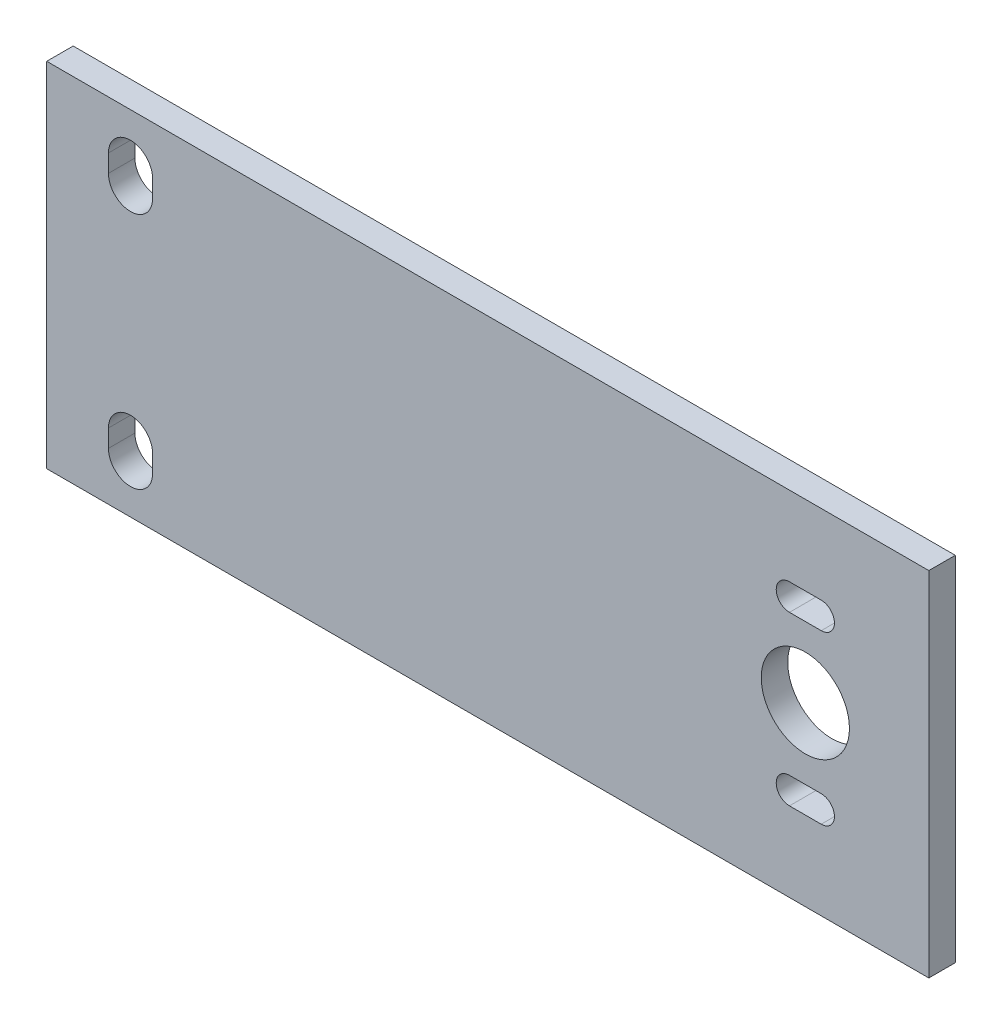
ISO-10303-21;
HEADER;
FILE_DESCRIPTION(('STEP AP214'),'2;1');
FILE_NAME('part.step','',(''),(''),'','','');
FILE_SCHEMA(('AUTOMOTIVE_DESIGN { 1 0 10303 214 1 1 1 1 }'));
ENDSEC;
DATA;
#1=APPLICATION_CONTEXT('core data for automotive mechanical design processes');
#2=APPLICATION_PROTOCOL_DEFINITION('international standard','automotive_design',2000,#1);
#3=PRODUCT_CONTEXT('',#1,'mechanical');
#4=PRODUCT('Part','Part','',(#3));
#5=PRODUCT_RELATED_PRODUCT_CATEGORY('part','',(#4));
#6=PRODUCT_DEFINITION_FORMATION('','',#4);
#7=PRODUCT_DEFINITION_CONTEXT('part definition',#1,'design');
#8=PRODUCT_DEFINITION('design','',#6,#7);
#9=PRODUCT_DEFINITION_SHAPE('','',#8);
#10=(LENGTH_UNIT() NAMED_UNIT(*) SI_UNIT(.MILLI.,.METRE.));
#11=(NAMED_UNIT(*) PLANE_ANGLE_UNIT() SI_UNIT($,.RADIAN.));
#12=(NAMED_UNIT(*) SI_UNIT($,.STERADIAN.) SOLID_ANGLE_UNIT());
#13=UNCERTAINTY_MEASURE_WITH_UNIT(LENGTH_MEASURE(1.E-05),#10,'distance_accuracy_value','');
#14=(GEOMETRIC_REPRESENTATION_CONTEXT(3) GLOBAL_UNCERTAINTY_ASSIGNED_CONTEXT((#13)) GLOBAL_UNIT_ASSIGNED_CONTEXT((#10,
#11,#12)) REPRESENTATION_CONTEXT('',''));
#15=CARTESIAN_POINT('',(0.,0.,0.));
#16=DIRECTION('',(0.,0.,1.));
#17=DIRECTION('',(1.,0.,0.));
#18=AXIS2_PLACEMENT_3D('',#15,#16,#17);
#19=CARTESIAN_POINT('',(0.,0.,0.));
#20=DIRECTION('',(0.,0.,1.));
#21=DIRECTION('',(1.,0.,0.));
#22=AXIS2_PLACEMENT_3D('',#19,#20,#21);
#23=PLANE('',#22);
#24=CARTESIAN_POINT('',(36.1579650546138,-6.81967213114753,0.));
#25=DIRECTION('',(0.,0.,1.));
#26=DIRECTION('',(-1.,0.,0.));
#27=AXIS2_PLACEMENT_3D('',#24,#25,#26);
#28=CIRCLE('',#27,1.5);
#29=CARTESIAN_POINT('',(36.1579650546138,-5.31967213114753,0.));
#30=VERTEX_POINT('',#29);
#31=CARTESIAN_POINT('',(36.1579650546138,-8.31967213114753,0.));
#32=VERTEX_POINT('',#31);
#33=EDGE_CURVE('E228',#30,#32,#28,.T.);
#34=ORIENTED_EDGE('',*,*,#33,.T.);
#35=DIRECTION('',(1.,0.,0.));
#36=VECTOR('',#35,1.);
#37=CARTESIAN_POINT('',(36.1579650546138,-8.31967213114753,0.));
#38=LINE('',#37,#36);
#39=CARTESIAN_POINT('',(39.7579650546138,-8.31967213114752,0.));
#40=VERTEX_POINT('',#39);
#41=EDGE_CURVE('E112',#32,#40,#38,.T.);
#42=ORIENTED_EDGE('',*,*,#41,.T.);
#43=CARTESIAN_POINT('',(39.7579650546138,-6.81967213114752,0.));
#44=DIRECTION('',(0.,0.,1.));
#45=DIRECTION('',(-1.,0.,0.));
#46=AXIS2_PLACEMENT_3D('',#43,#44,#45);
#47=CIRCLE('',#46,1.5);
#48=CARTESIAN_POINT('',(39.7579650546138,-5.31967213114752,0.));
#49=VERTEX_POINT('',#48);
#50=EDGE_CURVE('E222',#40,#49,#47,.T.);
#51=ORIENTED_EDGE('',*,*,#50,.T.);
#52=DIRECTION('',(-1.,0.,0.));
#53=VECTOR('',#52,1.);
#54=CARTESIAN_POINT('',(36.1579650546138,-5.31967213114753,0.));
#55=LINE('',#54,#53);
#56=EDGE_CURVE('E160',#49,#30,#55,.T.);
#57=ORIENTED_EDGE('',*,*,#56,.T.);
#58=EDGE_LOOP('',(#34,#42,#51,#57));
#59=FACE_BOUND('',#58,.T.);
#60=CARTESIAN_POINT('',(36.1579650546138,12.1803278688525,0.));
#61=DIRECTION('',(0.,0.,1.));
#62=DIRECTION('',(1.,0.,0.));
#63=AXIS2_PLACEMENT_3D('',#60,#61,#62);
#64=CIRCLE('',#63,1.49999999999999);
#65=CARTESIAN_POINT('',(36.1579650546138,13.6803278688525,0.));
#66=VERTEX_POINT('',#65);
#67=CARTESIAN_POINT('',(36.1579650546138,10.6803278688525,0.));
#68=VERTEX_POINT('',#67);
#69=EDGE_CURVE('E245',#66,#68,#64,.T.);
#70=ORIENTED_EDGE('',*,*,#69,.T.);
#71=DIRECTION('',(1.,0.,0.));
#72=VECTOR('',#71,1.);
#73=CARTESIAN_POINT('',(36.1579650546138,10.6803278688525,0.));
#74=LINE('',#73,#72);
#75=CARTESIAN_POINT('',(39.7579650546138,10.6803278688525,0.));
#76=VERTEX_POINT('',#75);
#77=EDGE_CURVE('E241',#68,#76,#74,.T.);
#78=ORIENTED_EDGE('',*,*,#77,.T.);
#79=CARTESIAN_POINT('',(39.7579650546138,12.1803278688525,0.));
#80=DIRECTION('',(0.,0.,1.));
#81=DIRECTION('',(1.,0.,0.));
#82=AXIS2_PLACEMENT_3D('',#79,#80,#81);
#83=CIRCLE('',#82,1.5);
#84=CARTESIAN_POINT('',(39.7579650546138,13.6803278688525,0.));
#85=VERTEX_POINT('',#84);
#86=EDGE_CURVE('E237',#76,#85,#83,.T.);
#87=ORIENTED_EDGE('',*,*,#86,.T.);
#88=DIRECTION('',(-1.,0.,0.));
#89=VECTOR('',#88,1.);
#90=CARTESIAN_POINT('',(36.1579650546138,13.6803278688525,0.));
#91=LINE('',#90,#89);
#92=EDGE_CURVE('E176',#85,#66,#91,.T.);
#93=ORIENTED_EDGE('',*,*,#92,.T.);
#94=EDGE_LOOP('',(#70,#78,#87,#93));
#95=FACE_BOUND('',#94,.T.);
#96=CARTESIAN_POINT('',(37.9579650546138,2.68032786885247,0.));
#97=DIRECTION('',(0.,0.,1.));
#98=DIRECTION('',(1.,0.,0.));
#99=AXIS2_PLACEMENT_3D('',#96,#97,#98);
#100=CIRCLE('',#99,5.);
#101=CARTESIAN_POINT('',(42.9579650546138,2.68032786885247,0.));
#102=VERTEX_POINT('',#101);
#103=EDGE_CURVE('E140',#102,#102,#100,.T.);
#104=ORIENTED_EDGE('',*,*,#103,.T.);
#105=EDGE_LOOP('',(#104));
#106=FACE_BOUND('',#105,.T.);
#107=DIRECTION('',(1.,0.,0.));
#108=VECTOR('',#107,1.);
#109=CARTESIAN_POINT('',(-48.0420349453862,-17.3196721311475,0.));
#110=LINE('',#109,#108);
#111=CARTESIAN_POINT('',(-48.0420349453862,-17.3196721311475,0.));
#112=VERTEX_POINT('',#111);
#113=CARTESIAN_POINT('',(51.9579650546138,-17.3196721311475,0.));
#114=VERTEX_POINT('',#113);
#115=EDGE_CURVE('E48',#112,#114,#110,.T.);
#116=ORIENTED_EDGE('',*,*,#115,.F.);
#117=DIRECTION('',(0.,-1.,0.));
#118=VECTOR('',#117,1.);
#119=CARTESIAN_POINT('',(-48.0420349453862,22.6803278688525,0.));
#120=LINE('',#119,#118);
#121=CARTESIAN_POINT('',(-48.0420349453862,22.6803278688525,0.));
#122=VERTEX_POINT('',#121);
#123=EDGE_CURVE('E320',#122,#112,#120,.T.);
#124=ORIENTED_EDGE('',*,*,#123,.F.);
#125=DIRECTION('',(-1.,0.,0.));
#126=VECTOR('',#125,1.);
#127=CARTESIAN_POINT('',(-48.0420349453862,22.6803278688525,0.));
#128=LINE('',#127,#126);
#129=CARTESIAN_POINT('',(51.9579650546138,22.6803278688525,0.));
#130=VERTEX_POINT('',#129);
#131=EDGE_CURVE('E171',#130,#122,#128,.T.);
#132=ORIENTED_EDGE('',*,*,#131,.F.);
#133=DIRECTION('',(0.,1.,0.));
#134=VECTOR('',#133,1.);
#135=CARTESIAN_POINT('',(51.9579650546138,22.6803278688525,0.));
#136=LINE('',#135,#134);
#137=EDGE_CURVE('E175',#114,#130,#136,.T.);
#138=ORIENTED_EDGE('',*,*,#137,.F.);
#139=EDGE_LOOP('',(#116,#124,#132,#138));
#140=FACE_BOUND('',#139,.T.);
#141=CARTESIAN_POINT('',(-38.5420349453862,17.1803278688525,0.));
#142=DIRECTION('',(0.,0.,1.));
#143=DIRECTION('',(1.,0.,0.));
#144=AXIS2_PLACEMENT_3D('',#141,#142,#143);
#145=CIRCLE('',#144,2.5);
#146=CARTESIAN_POINT('',(-36.0420349453862,17.1803278688525,0.));
#147=VERTEX_POINT('',#146);
#148=CARTESIAN_POINT('',(-41.0420349453862,17.1803278688525,0.));
#149=VERTEX_POINT('',#148);
#150=EDGE_CURVE('E324',#147,#149,#145,.T.);
#151=ORIENTED_EDGE('',*,*,#150,.T.);
#152=DIRECTION('',(0.,-1.,0.));
#153=VECTOR('',#152,1.);
#154=CARTESIAN_POINT('',(-41.0420349453862,17.1803278688525,0.));
#155=LINE('',#154,#153);
#156=CARTESIAN_POINT('',(-41.0420349453862,15.1803278688525,0.));
#157=VERTEX_POINT('',#156);
#158=EDGE_CURVE('E328',#149,#157,#155,.T.);
#159=ORIENTED_EDGE('',*,*,#158,.T.);
#160=CARTESIAN_POINT('',(-38.5420349453862,15.1803278688525,0.));
#161=DIRECTION('',(0.,0.,1.));
#162=DIRECTION('',(1.,0.,0.));
#163=AXIS2_PLACEMENT_3D('',#160,#161,#162);
#164=CIRCLE('',#163,2.5);
#165=CARTESIAN_POINT('',(-36.0420349453862,15.1803278688525,0.));
#166=VERTEX_POINT('',#165);
#167=EDGE_CURVE('E332',#157,#166,#164,.T.);
#168=ORIENTED_EDGE('',*,*,#167,.T.);
#169=DIRECTION('',(0.,1.,0.));
#170=VECTOR('',#169,1.);
#171=CARTESIAN_POINT('',(-36.0420349453862,17.1803278688525,0.));
#172=LINE('',#171,#170);
#173=EDGE_CURVE('E336',#166,#147,#172,.T.);
#174=ORIENTED_EDGE('',*,*,#173,.T.);
#175=EDGE_LOOP('',(#151,#159,#168,#174));
#176=FACE_BOUND('',#175,.T.);
#177=CARTESIAN_POINT('',(-38.5420349453862,-9.81967213114753,0.));
#178=DIRECTION('',(0.,0.,1.));
#179=DIRECTION('',(1.,0.,0.));
#180=AXIS2_PLACEMENT_3D('',#177,#178,#179);
#181=CIRCLE('',#180,2.5);
#182=CARTESIAN_POINT('',(-36.0420349453862,-9.81967213114752,0.));
#183=VERTEX_POINT('',#182);
#184=CARTESIAN_POINT('',(-41.0420349453862,-9.81967213114753,0.));
#185=VERTEX_POINT('',#184);
#186=EDGE_CURVE('E340',#183,#185,#181,.T.);
#187=ORIENTED_EDGE('',*,*,#186,.T.);
#188=DIRECTION('',(0.,-1.,0.));
#189=VECTOR('',#188,1.);
#190=CARTESIAN_POINT('',(-41.0420349453862,-9.81967213114753,0.));
#191=LINE('',#190,#189);
#192=CARTESIAN_POINT('',(-41.0420349453862,-11.8196721311475,0.));
#193=VERTEX_POINT('',#192);
#194=EDGE_CURVE('E344',#185,#193,#191,.T.);
#195=ORIENTED_EDGE('',*,*,#194,.T.);
#196=CARTESIAN_POINT('',(-38.5420349453862,-11.8196721311475,0.));
#197=DIRECTION('',(0.,0.,1.));
#198=DIRECTION('',(1.,0.,0.));
#199=AXIS2_PLACEMENT_3D('',#196,#197,#198);
#200=CIRCLE('',#199,2.5);
#201=CARTESIAN_POINT('',(-36.0420349453862,-11.8196721311475,0.));
#202=VERTEX_POINT('',#201);
#203=EDGE_CURVE('E348',#193,#202,#200,.T.);
#204=ORIENTED_EDGE('',*,*,#203,.T.);
#205=DIRECTION('',(0.,1.,0.));
#206=VECTOR('',#205,1.);
#207=CARTESIAN_POINT('',(-36.0420349453862,-9.81967213114752,0.));
#208=LINE('',#207,#206);
#209=EDGE_CURVE('E352',#202,#183,#208,.T.);
#210=ORIENTED_EDGE('',*,*,#209,.T.);
#211=EDGE_LOOP('',(#187,#195,#204,#210));
#212=FACE_BOUND('',#211,.T.);
#213=ADVANCED_FACE('F45',(#59,#95,#106,#140,#176,#212),#23,.F.);
#214=CARTESIAN_POINT('',(39.7579650546138,-6.81967213114752,0.));
#215=DIRECTION('',(0.,0.,1.));
#216=DIRECTION('',(1.,0.,0.));
#217=AXIS2_PLACEMENT_3D('',#214,#215,#216);
#218=CYLINDRICAL_SURFACE('',#217,1.5);
#219=DIRECTION('',(0.,0.,-1.));
#220=VECTOR('',#219,1.);
#221=CARTESIAN_POINT('',(39.7579650546138,-8.31967213114752,0.));
#222=LINE('',#221,#220);
#223=CARTESIAN_POINT('',(39.7579650546138,-8.31967213114752,3.));
#224=VERTEX_POINT('',#223);
#225=EDGE_CURVE('E12',#224,#40,#222,.T.);
#226=ORIENTED_EDGE('',*,*,#225,.F.);
#227=CARTESIAN_POINT('',(39.7579650546138,-6.81967213114752,3.));
#228=DIRECTION('',(0.,0.,1.));
#229=DIRECTION('',(1.,0.,0.));
#230=AXIS2_PLACEMENT_3D('',#227,#228,#229);
#231=CIRCLE('',#230,1.5);
#232=CARTESIAN_POINT('',(39.7579650546138,-5.31967213114752,3.));
#233=VERTEX_POINT('',#232);
#234=EDGE_CURVE('E125',#224,#233,#231,.T.);
#235=ORIENTED_EDGE('',*,*,#234,.T.);
#236=DIRECTION('',(0.,0.,-1.));
#237=VECTOR('',#236,1.);
#238=CARTESIAN_POINT('',(39.7579650546138,-5.31967213114752,0.));
#239=LINE('',#238,#237);
#240=EDGE_CURVE('E55',#233,#49,#239,.T.);
#241=ORIENTED_EDGE('',*,*,#240,.T.);
#242=ORIENTED_EDGE('',*,*,#50,.F.);
#243=EDGE_LOOP('',(#226,#235,#241,#242));
#244=FACE_BOUND('',#243,.T.);
#245=ADVANCED_FACE('F434',(#244),#218,.F.);
#246=CARTESIAN_POINT('',(36.1579650546138,-5.31967213114753,0.));
#247=DIRECTION('',(0.,1.,0.));
#248=DIRECTION('',(-1.,0.,0.));
#249=AXIS2_PLACEMENT_3D('',#246,#247,#248);
#250=PLANE('',#249);
#251=ORIENTED_EDGE('',*,*,#240,.F.);
#252=DIRECTION('',(1.,0.,0.));
#253=VECTOR('',#252,1.);
#254=CARTESIAN_POINT('',(0.,-5.31967213114752,3.));
#255=LINE('',#254,#253);
#256=CARTESIAN_POINT('',(36.1579650546138,-5.31967213114753,3.));
#257=VERTEX_POINT('',#256);
#258=EDGE_CURVE('E137',#233,#257,#255,.F.);
#259=ORIENTED_EDGE('',*,*,#258,.T.);
#260=DIRECTION('',(0.,0.,-1.));
#261=VECTOR('',#260,1.);
#262=CARTESIAN_POINT('',(36.1579650546138,-5.31967213114753,0.));
#263=LINE('',#262,#261);
#264=EDGE_CURVE('E64',#257,#30,#263,.T.);
#265=ORIENTED_EDGE('',*,*,#264,.T.);
#266=ORIENTED_EDGE('',*,*,#56,.F.);
#267=EDGE_LOOP('',(#251,#259,#265,#266));
#268=FACE_BOUND('',#267,.T.);
#269=ADVANCED_FACE('F435',(#268),#250,.F.);
#270=CARTESIAN_POINT('',(36.1579650546138,-6.81967213114753,0.));
#271=DIRECTION('',(0.,0.,1.));
#272=DIRECTION('',(1.,0.,0.));
#273=AXIS2_PLACEMENT_3D('',#270,#271,#272);
#274=CYLINDRICAL_SURFACE('',#273,1.5);
#275=ORIENTED_EDGE('',*,*,#264,.F.);
#276=CARTESIAN_POINT('',(36.1579650546138,-6.81967213114753,3.));
#277=DIRECTION('',(0.,0.,1.));
#278=DIRECTION('',(1.,0.,0.));
#279=AXIS2_PLACEMENT_3D('',#276,#277,#278);
#280=CIRCLE('',#279,1.5);
#281=CARTESIAN_POINT('',(36.1579650546138,-8.31967213114753,3.));
#282=VERTEX_POINT('',#281);
#283=EDGE_CURVE('E124',#257,#282,#280,.T.);
#284=ORIENTED_EDGE('',*,*,#283,.T.);
#285=DIRECTION('',(0.,0.,-1.));
#286=VECTOR('',#285,1.);
#287=CARTESIAN_POINT('',(36.1579650546138,-8.31967213114753,0.));
#288=LINE('',#287,#286);
#289=EDGE_CURVE('E106',#282,#32,#288,.T.);
#290=ORIENTED_EDGE('',*,*,#289,.T.);
#291=ORIENTED_EDGE('',*,*,#33,.F.);
#292=EDGE_LOOP('',(#275,#284,#290,#291));
#293=FACE_BOUND('',#292,.T.);
#294=ADVANCED_FACE('F128',(#293),#274,.F.);
#295=CARTESIAN_POINT('',(51.9579650546138,22.6803278688525,0.));
#296=DIRECTION('',(1.,0.,0.));
#297=DIRECTION('',(0.,1.,0.));
#298=AXIS2_PLACEMENT_3D('',#295,#296,#297);
#299=PLANE('',#298);
#300=DIRECTION('',(0.,0.,-1.));
#301=VECTOR('',#300,1.);
#302=CARTESIAN_POINT('',(51.9579650546138,22.6803278688525,0.));
#303=LINE('',#302,#301);
#304=CARTESIAN_POINT('',(51.9579650546138,22.6803278688525,3.));
#305=VERTEX_POINT('',#304);
#306=EDGE_CURVE('E117',#305,#130,#303,.T.);
#307=ORIENTED_EDGE('',*,*,#306,.F.);
#308=DIRECTION('',(0.,1.,0.));
#309=VECTOR('',#308,1.);
#310=CARTESIAN_POINT('',(51.9579650546138,0.,3.));
#311=LINE('',#310,#309);
#312=CARTESIAN_POINT('',(51.9579650546138,-17.3196721311475,3.));
#313=VERTEX_POINT('',#312);
#314=EDGE_CURVE('E133',#313,#305,#311,.T.);
#315=ORIENTED_EDGE('',*,*,#314,.F.);
#316=DIRECTION('',(0.,0.,-1.));
#317=VECTOR('',#316,1.);
#318=CARTESIAN_POINT('',(51.9579650546138,-17.3196721311475,0.));
#319=LINE('',#318,#317);
#320=EDGE_CURVE('E156',#313,#114,#319,.T.);
#321=ORIENTED_EDGE('',*,*,#320,.T.);
#322=ORIENTED_EDGE('',*,*,#137,.T.);
#323=EDGE_LOOP('',(#307,#315,#321,#322));
#324=FACE_BOUND('',#323,.T.);
#325=ADVANCED_FACE('F442',(#324),#299,.T.);
#326=CARTESIAN_POINT('',(-48.0420349453862,-17.3196721311475,0.));
#327=DIRECTION('',(0.,-1.,0.));
#328=DIRECTION('',(1.,0.,0.));
#329=AXIS2_PLACEMENT_3D('',#326,#327,#328);
#330=PLANE('',#329);
#331=DIRECTION('',(1.,0.,0.));
#332=VECTOR('',#331,1.);
#333=CARTESIAN_POINT('',(0.,-17.3196721311475,3.));
#334=LINE('',#333,#332);
#335=CARTESIAN_POINT('',(-48.0420349453862,-17.3196721311475,3.));
#336=VERTEX_POINT('',#335);
#337=EDGE_CURVE('E130',#336,#313,#334,.T.);
#338=ORIENTED_EDGE('',*,*,#337,.F.);
#339=DIRECTION('',(0.,0.,-1.));
#340=VECTOR('',#339,1.);
#341=CARTESIAN_POINT('',(-48.0420349453862,-17.3196721311475,0.));
#342=LINE('',#341,#340);
#343=EDGE_CURVE('E216',#336,#112,#342,.T.);
#344=ORIENTED_EDGE('',*,*,#343,.T.);
#345=ORIENTED_EDGE('',*,*,#115,.T.);
#346=ORIENTED_EDGE('',*,*,#320,.F.);
#347=EDGE_LOOP('',(#338,#344,#345,#346));
#348=FACE_BOUND('',#347,.T.);
#349=ADVANCED_FACE('F363',(#348),#330,.T.);
#350=CARTESIAN_POINT('',(39.7579650546138,12.1803278688525,0.));
#351=DIRECTION('',(0.,0.,1.));
#352=DIRECTION('',(1.,0.,0.));
#353=AXIS2_PLACEMENT_3D('',#350,#351,#352);
#354=CYLINDRICAL_SURFACE('',#353,1.5);
#355=DIRECTION('',(0.,0.,-1.));
#356=VECTOR('',#355,1.);
#357=CARTESIAN_POINT('',(39.7579650546138,10.6803278688525,0.));
#358=LINE('',#357,#356);
#359=CARTESIAN_POINT('',(39.7579650546138,10.6803278688525,3.));
#360=VERTEX_POINT('',#359);
#361=EDGE_CURVE('E152',#360,#76,#358,.T.);
#362=ORIENTED_EDGE('',*,*,#361,.F.);
#363=CARTESIAN_POINT('',(39.7579650546138,12.1803278688525,3.));
#364=DIRECTION('',(0.,0.,1.));
#365=DIRECTION('',(1.,0.,0.));
#366=AXIS2_PLACEMENT_3D('',#363,#364,#365);
#367=CIRCLE('',#366,1.5);
#368=CARTESIAN_POINT('',(39.7579650546138,13.6803278688525,3.));
#369=VERTEX_POINT('',#368);
#370=EDGE_CURVE('E190',#360,#369,#367,.T.);
#371=ORIENTED_EDGE('',*,*,#370,.T.);
#372=DIRECTION('',(0.,0.,-1.));
#373=VECTOR('',#372,1.);
#374=CARTESIAN_POINT('',(39.7579650546138,13.6803278688525,0.));
#375=LINE('',#374,#373);
#376=EDGE_CURVE('E147',#369,#85,#375,.T.);
#377=ORIENTED_EDGE('',*,*,#376,.T.);
#378=ORIENTED_EDGE('',*,*,#86,.F.);
#379=EDGE_LOOP('',(#362,#371,#377,#378));
#380=FACE_BOUND('',#379,.T.);
#381=ADVANCED_FACE('F486',(#380),#354,.F.);
#382=CARTESIAN_POINT('',(36.1579650546138,13.6803278688525,0.));
#383=DIRECTION('',(0.,1.,0.));
#384=DIRECTION('',(-1.,0.,0.));
#385=AXIS2_PLACEMENT_3D('',#382,#383,#384);
#386=PLANE('',#385);
#387=ORIENTED_EDGE('',*,*,#376,.F.);
#388=DIRECTION('',(1.,0.,0.));
#389=VECTOR('',#388,1.);
#390=CARTESIAN_POINT('',(0.,13.6803278688525,3.));
#391=LINE('',#390,#389);
#392=CARTESIAN_POINT('',(36.1579650546138,13.6803278688525,3.));
#393=VERTEX_POINT('',#392);
#394=EDGE_CURVE('E180',#369,#393,#391,.F.);
#395=ORIENTED_EDGE('',*,*,#394,.T.);
#396=DIRECTION('',(0.,0.,-1.));
#397=VECTOR('',#396,1.);
#398=CARTESIAN_POINT('',(36.1579650546138,13.6803278688525,0.));
#399=LINE('',#398,#397);
#400=EDGE_CURVE('E143',#393,#66,#399,.T.);
#401=ORIENTED_EDGE('',*,*,#400,.T.);
#402=ORIENTED_EDGE('',*,*,#92,.F.);
#403=EDGE_LOOP('',(#387,#395,#401,#402));
#404=FACE_BOUND('',#403,.T.);
#405=ADVANCED_FACE('F497',(#404),#386,.F.);
#406=CARTESIAN_POINT('',(36.1579650546138,12.1803278688525,0.));
#407=DIRECTION('',(0.,0.,1.));
#408=DIRECTION('',(1.,0.,0.));
#409=AXIS2_PLACEMENT_3D('',#406,#407,#408);
#410=CYLINDRICAL_SURFACE('',#409,1.49999999999999);
#411=ORIENTED_EDGE('',*,*,#400,.F.);
#412=CARTESIAN_POINT('',(36.1579650546138,12.1803278688525,3.));
#413=DIRECTION('',(0.,0.,1.));
#414=DIRECTION('',(1.,0.,0.));
#415=AXIS2_PLACEMENT_3D('',#412,#413,#414);
#416=CIRCLE('',#415,1.49999999999999);
#417=CARTESIAN_POINT('',(36.1579650546138,10.6803278688525,3.));
#418=VERTEX_POINT('',#417);
#419=EDGE_CURVE('E199',#393,#418,#416,.T.);
#420=ORIENTED_EDGE('',*,*,#419,.T.);
#421=DIRECTION('',(0.,0.,-1.));
#422=VECTOR('',#421,1.);
#423=CARTESIAN_POINT('',(36.1579650546138,10.6803278688525,0.));
#424=LINE('',#423,#422);
#425=EDGE_CURVE('E148',#418,#68,#424,.T.);
#426=ORIENTED_EDGE('',*,*,#425,.T.);
#427=ORIENTED_EDGE('',*,*,#69,.F.);
#428=EDGE_LOOP('',(#411,#420,#426,#427));
#429=FACE_BOUND('',#428,.T.);
#430=ADVANCED_FACE('F508',(#429),#410,.F.);
#431=CARTESIAN_POINT('',(37.9579650546138,2.68032786885247,0.));
#432=DIRECTION('',(0.,0.,1.));
#433=DIRECTION('',(1.,0.,0.));
#434=AXIS2_PLACEMENT_3D('',#431,#432,#433);
#435=CYLINDRICAL_SURFACE('',#434,5.);
#436=ORIENTED_EDGE('',*,*,#103,.F.);
#437=EDGE_LOOP('',(#436));
#438=FACE_BOUND('',#437,.T.);
#439=CARTESIAN_POINT('',(37.9579650546138,2.68032786885247,3.));
#440=DIRECTION('',(0.,0.,1.));
#441=DIRECTION('',(1.,0.,0.));
#442=AXIS2_PLACEMENT_3D('',#439,#440,#441);
#443=CIRCLE('',#442,5.);
#444=CARTESIAN_POINT('',(42.9579650546138,2.68032786885247,3.));
#445=VERTEX_POINT('',#444);
#446=EDGE_CURVE('E207',#445,#445,#443,.T.);
#447=ORIENTED_EDGE('',*,*,#446,.T.);
#448=EDGE_LOOP('',(#447));
#449=FACE_BOUND('',#448,.T.);
#450=ADVANCED_FACE('F518',(#438,#449),#435,.F.);
#451=CARTESIAN_POINT('',(36.1579650546138,10.6803278688525,0.));
#452=DIRECTION('',(0.,-1.,0.));
#453=DIRECTION('',(1.,0.,0.));
#454=AXIS2_PLACEMENT_3D('',#451,#452,#453);
#455=PLANE('',#454);
#456=DIRECTION('',(1.,0.,0.));
#457=VECTOR('',#456,1.);
#458=CARTESIAN_POINT('',(0.,10.6803278688525,3.));
#459=LINE('',#458,#457);
#460=EDGE_CURVE('E196',#418,#360,#459,.T.);
#461=ORIENTED_EDGE('',*,*,#460,.T.);
#462=ORIENTED_EDGE('',*,*,#361,.T.);
#463=ORIENTED_EDGE('',*,*,#77,.F.);
#464=ORIENTED_EDGE('',*,*,#425,.F.);
#465=EDGE_LOOP('',(#461,#462,#463,#464));
#466=FACE_BOUND('',#465,.T.);
#467=ADVANCED_FACE('F528',(#466),#455,.F.);
#468=CARTESIAN_POINT('',(-48.0420349453862,22.6803278688525,0.));
#469=DIRECTION('',(0.,1.,0.));
#470=DIRECTION('',(-1.,0.,0.));
#471=AXIS2_PLACEMENT_3D('',#468,#469,#470);
#472=PLANE('',#471);
#473=ORIENTED_EDGE('',*,*,#131,.T.);
#474=DIRECTION('',(0.,0.,-1.));
#475=VECTOR('',#474,1.);
#476=CARTESIAN_POINT('',(-48.0420349453862,22.6803278688525,0.));
#477=LINE('',#476,#475);
#478=CARTESIAN_POINT('',(-48.0420349453862,22.6803278688525,3.));
#479=VERTEX_POINT('',#478);
#480=EDGE_CURVE('E316',#479,#122,#477,.T.);
#481=ORIENTED_EDGE('',*,*,#480,.F.);
#482=DIRECTION('',(1.,0.,0.));
#483=VECTOR('',#482,1.);
#484=CARTESIAN_POINT('',(0.,22.6803278688525,3.));
#485=LINE('',#484,#483);
#486=EDGE_CURVE('E177',#305,#479,#485,.F.);
#487=ORIENTED_EDGE('',*,*,#486,.F.);
#488=ORIENTED_EDGE('',*,*,#306,.T.);
#489=EDGE_LOOP('',(#473,#481,#487,#488));
#490=FACE_BOUND('',#489,.T.);
#491=ADVANCED_FACE('F539',(#490),#472,.T.);
#492=CARTESIAN_POINT('',(36.1579650546138,-8.31967213114753,0.));
#493=DIRECTION('',(0.,-1.,0.));
#494=DIRECTION('',(1.,0.,0.));
#495=AXIS2_PLACEMENT_3D('',#492,#493,#494);
#496=PLANE('',#495);
#497=DIRECTION('',(1.,0.,0.));
#498=VECTOR('',#497,1.);
#499=CARTESIAN_POINT('',(0.,-8.31967213114753,3.));
#500=LINE('',#499,#498);
#501=EDGE_CURVE('E109',#282,#224,#500,.T.);
#502=ORIENTED_EDGE('',*,*,#501,.T.);
#503=ORIENTED_EDGE('',*,*,#225,.T.);
#504=ORIENTED_EDGE('',*,*,#41,.F.);
#505=ORIENTED_EDGE('',*,*,#289,.F.);
#506=EDGE_LOOP('',(#502,#503,#504,#505));
#507=FACE_BOUND('',#506,.T.);
#508=ADVANCED_FACE('F108',(#507),#496,.F.);
#509=CARTESIAN_POINT('',(0.,0.,3.));
#510=DIRECTION('',(0.,0.,1.));
#511=DIRECTION('',(1.,0.,0.));
#512=AXIS2_PLACEMENT_3D('',#509,#510,#511);
#513=PLANE('',#512);
#514=ORIENTED_EDGE('',*,*,#486,.T.);
#515=DIRECTION('',(0.,1.,0.));
#516=VECTOR('',#515,1.);
#517=CARTESIAN_POINT('',(-48.0420349453862,0.,3.));
#518=LINE('',#517,#516);
#519=EDGE_CURVE('E212',#479,#336,#518,.F.);
#520=ORIENTED_EDGE('',*,*,#519,.T.);
#521=ORIENTED_EDGE('',*,*,#337,.T.);
#522=ORIENTED_EDGE('',*,*,#314,.T.);
#523=EDGE_LOOP('',(#514,#520,#521,#522));
#524=FACE_BOUND('',#523,.T.);
#525=ORIENTED_EDGE('',*,*,#446,.F.);
#526=EDGE_LOOP('',(#525));
#527=FACE_BOUND('',#526,.T.);
#528=ORIENTED_EDGE('',*,*,#419,.F.);
#529=ORIENTED_EDGE('',*,*,#394,.F.);
#530=ORIENTED_EDGE('',*,*,#370,.F.);
#531=ORIENTED_EDGE('',*,*,#460,.F.);
#532=EDGE_LOOP('',(#528,#529,#530,#531));
#533=FACE_BOUND('',#532,.T.);
#534=ORIENTED_EDGE('',*,*,#283,.F.);
#535=ORIENTED_EDGE('',*,*,#258,.F.);
#536=ORIENTED_EDGE('',*,*,#234,.F.);
#537=ORIENTED_EDGE('',*,*,#501,.F.);
#538=EDGE_LOOP('',(#534,#535,#536,#537));
#539=FACE_BOUND('',#538,.T.);
#540=CARTESIAN_POINT('',(-38.5420349453862,-9.81967213114753,3.));
#541=DIRECTION('',(0.,0.,1.));
#542=DIRECTION('',(1.,0.,0.));
#543=AXIS2_PLACEMENT_3D('',#540,#541,#542);
#544=CIRCLE('',#543,2.5);
#545=CARTESIAN_POINT('',(-36.0420349453862,-9.81967213114752,3.));
#546=VERTEX_POINT('',#545);
#547=CARTESIAN_POINT('',(-41.0420349453862,-9.81967213114753,3.));
#548=VERTEX_POINT('',#547);
#549=EDGE_CURVE('E276',#546,#548,#544,.T.);
#550=ORIENTED_EDGE('',*,*,#549,.F.);
#551=DIRECTION('',(0.,1.,0.));
#552=VECTOR('',#551,1.);
#553=CARTESIAN_POINT('',(-36.0420349453862,0.,3.));
#554=LINE('',#553,#552);
#555=CARTESIAN_POINT('',(-36.0420349453862,-11.8196721311475,3.));
#556=VERTEX_POINT('',#555);
#557=EDGE_CURVE('E252',#556,#546,#554,.T.);
#558=ORIENTED_EDGE('',*,*,#557,.F.);
#559=CARTESIAN_POINT('',(-38.5420349453862,-11.8196721311475,3.));
#560=DIRECTION('',(0.,0.,1.));
#561=DIRECTION('',(1.,0.,0.));
#562=AXIS2_PLACEMENT_3D('',#559,#560,#561);
#563=CIRCLE('',#562,2.5);
#564=CARTESIAN_POINT('',(-41.0420349453862,-11.8196721311475,3.));
#565=VERTEX_POINT('',#564);
#566=EDGE_CURVE('E260',#565,#556,#563,.T.);
#567=ORIENTED_EDGE('',*,*,#566,.F.);
#568=DIRECTION('',(0.,1.,0.));
#569=VECTOR('',#568,1.);
#570=CARTESIAN_POINT('',(-41.0420349453862,0.,3.));
#571=LINE('',#570,#569);
#572=EDGE_CURVE('E268',#548,#565,#571,.F.);
#573=ORIENTED_EDGE('',*,*,#572,.F.);
#574=EDGE_LOOP('',(#550,#558,#567,#573));
#575=FACE_BOUND('',#574,.T.);
#576=CARTESIAN_POINT('',(-38.5420349453862,17.1803278688525,3.));
#577=DIRECTION('',(0.,0.,1.));
#578=DIRECTION('',(1.,0.,0.));
#579=AXIS2_PLACEMENT_3D('',#576,#577,#578);
#580=CIRCLE('',#579,2.5);
#581=CARTESIAN_POINT('',(-36.0420349453862,17.1803278688525,3.));
#582=VERTEX_POINT('',#581);
#583=CARTESIAN_POINT('',(-41.0420349453862,17.1803278688525,3.));
#584=VERTEX_POINT('',#583);
#585=EDGE_CURVE('E308',#582,#584,#580,.T.);
#586=ORIENTED_EDGE('',*,*,#585,.F.);
#587=DIRECTION('',(0.,1.,0.));
#588=VECTOR('',#587,1.);
#589=CARTESIAN_POINT('',(-36.0420349453862,0.,3.));
#590=LINE('',#589,#588);
#591=CARTESIAN_POINT('',(-36.0420349453862,15.1803278688525,3.));
#592=VERTEX_POINT('',#591);
#593=EDGE_CURVE('E284',#592,#582,#590,.T.);
#594=ORIENTED_EDGE('',*,*,#593,.F.);
#595=CARTESIAN_POINT('',(-38.5420349453862,15.1803278688525,3.));
#596=DIRECTION('',(0.,0.,1.));
#597=DIRECTION('',(1.,0.,0.));
#598=AXIS2_PLACEMENT_3D('',#595,#596,#597);
#599=CIRCLE('',#598,2.5);
#600=CARTESIAN_POINT('',(-41.0420349453862,15.1803278688525,3.));
#601=VERTEX_POINT('',#600);
#602=EDGE_CURVE('E292',#601,#592,#599,.T.);
#603=ORIENTED_EDGE('',*,*,#602,.F.);
#604=DIRECTION('',(0.,1.,0.));
#605=VECTOR('',#604,1.);
#606=CARTESIAN_POINT('',(-41.0420349453862,0.,3.));
#607=LINE('',#606,#605);
#608=EDGE_CURVE('E300',#584,#601,#607,.F.);
#609=ORIENTED_EDGE('',*,*,#608,.F.);
#610=EDGE_LOOP('',(#586,#594,#603,#609));
#611=FACE_BOUND('',#610,.T.);
#612=ADVANCED_FACE('F121',(#524,#527,#533,#539,#575,#611),#513,.T.);
#613=CARTESIAN_POINT('',(-36.0420349453862,-9.81967213114752,0.));
#614=DIRECTION('',(1.,0.,0.));
#615=DIRECTION('',(0.,1.,0.));
#616=AXIS2_PLACEMENT_3D('',#613,#614,#615);
#617=PLANE('',#616);
#618=DIRECTION('',(0.,0.,-1.));
#619=VECTOR('',#618,1.);
#620=CARTESIAN_POINT('',(-36.0420349453862,-11.8196721311475,0.));
#621=LINE('',#620,#619);
#622=EDGE_CURVE('E264',#556,#202,#621,.T.);
#623=ORIENTED_EDGE('',*,*,#622,.F.);
#624=ORIENTED_EDGE('',*,*,#557,.T.);
#625=DIRECTION('',(0.,0.,-1.));
#626=VECTOR('',#625,1.);
#627=CARTESIAN_POINT('',(-36.0420349453862,-9.81967213114752,0.));
#628=LINE('',#627,#626);
#629=EDGE_CURVE('E256',#546,#183,#628,.T.);
#630=ORIENTED_EDGE('',*,*,#629,.T.);
#631=ORIENTED_EDGE('',*,*,#209,.F.);
#632=EDGE_LOOP('',(#623,#624,#630,#631));
#633=FACE_BOUND('',#632,.T.);
#634=ADVANCED_FACE('F567',(#633),#617,.F.);
#635=CARTESIAN_POINT('',(-38.5420349453862,-11.8196721311475,0.));
#636=DIRECTION('',(0.,0.,1.));
#637=DIRECTION('',(1.,0.,0.));
#638=AXIS2_PLACEMENT_3D('',#635,#636,#637);
#639=CYLINDRICAL_SURFACE('',#638,2.5);
#640=DIRECTION('',(0.,0.,-1.));
#641=VECTOR('',#640,1.);
#642=CARTESIAN_POINT('',(-41.0420349453862,-11.8196721311475,0.));
#643=LINE('',#642,#641);
#644=EDGE_CURVE('E272',#565,#193,#643,.T.);
#645=ORIENTED_EDGE('',*,*,#644,.F.);
#646=ORIENTED_EDGE('',*,*,#566,.T.);
#647=ORIENTED_EDGE('',*,*,#622,.T.);
#648=ORIENTED_EDGE('',*,*,#203,.F.);
#649=EDGE_LOOP('',(#645,#646,#647,#648));
#650=FACE_BOUND('',#649,.T.);
#651=ADVANCED_FACE('F577',(#650),#639,.F.);
#652=CARTESIAN_POINT('',(-41.0420349453862,-9.81967213114753,0.));
#653=DIRECTION('',(-1.,0.,0.));
#654=DIRECTION('',(0.,-1.,0.));
#655=AXIS2_PLACEMENT_3D('',#652,#653,#654);
#656=PLANE('',#655);
#657=ORIENTED_EDGE('',*,*,#572,.T.);
#658=ORIENTED_EDGE('',*,*,#644,.T.);
#659=ORIENTED_EDGE('',*,*,#194,.F.);
#660=DIRECTION('',(0.,0.,-1.));
#661=VECTOR('',#660,1.);
#662=CARTESIAN_POINT('',(-41.0420349453862,-9.81967213114753,0.));
#663=LINE('',#662,#661);
#664=EDGE_CURVE('E280',#548,#185,#663,.T.);
#665=ORIENTED_EDGE('',*,*,#664,.F.);
#666=EDGE_LOOP('',(#657,#658,#659,#665));
#667=FACE_BOUND('',#666,.T.);
#668=ADVANCED_FACE('F589',(#667),#656,.F.);
#669=CARTESIAN_POINT('',(-38.5420349453862,-9.81967213114753,0.));
#670=DIRECTION('',(0.,0.,1.));
#671=DIRECTION('',(1.,0.,0.));
#672=AXIS2_PLACEMENT_3D('',#669,#670,#671);
#673=CYLINDRICAL_SURFACE('',#672,2.5);
#674=ORIENTED_EDGE('',*,*,#629,.F.);
#675=ORIENTED_EDGE('',*,*,#549,.T.);
#676=ORIENTED_EDGE('',*,*,#664,.T.);
#677=ORIENTED_EDGE('',*,*,#186,.F.);
#678=EDGE_LOOP('',(#674,#675,#676,#677));
#679=FACE_BOUND('',#678,.T.);
#680=ADVANCED_FACE('F600',(#679),#673,.F.);
#681=CARTESIAN_POINT('',(-36.0420349453862,17.1803278688525,0.));
#682=DIRECTION('',(1.,0.,0.));
#683=DIRECTION('',(0.,1.,0.));
#684=AXIS2_PLACEMENT_3D('',#681,#682,#683);
#685=PLANE('',#684);
#686=DIRECTION('',(0.,0.,-1.));
#687=VECTOR('',#686,1.);
#688=CARTESIAN_POINT('',(-36.0420349453862,15.1803278688525,0.));
#689=LINE('',#688,#687);
#690=EDGE_CURVE('E296',#592,#166,#689,.T.);
#691=ORIENTED_EDGE('',*,*,#690,.F.);
#692=ORIENTED_EDGE('',*,*,#593,.T.);
#693=DIRECTION('',(0.,0.,-1.));
#694=VECTOR('',#693,1.);
#695=CARTESIAN_POINT('',(-36.0420349453862,17.1803278688525,0.));
#696=LINE('',#695,#694);
#697=EDGE_CURVE('E288',#582,#147,#696,.T.);
#698=ORIENTED_EDGE('',*,*,#697,.T.);
#699=ORIENTED_EDGE('',*,*,#173,.F.);
#700=EDGE_LOOP('',(#691,#692,#698,#699));
#701=FACE_BOUND('',#700,.T.);
#702=ADVANCED_FACE('F611',(#701),#685,.F.);
#703=CARTESIAN_POINT('',(-38.5420349453862,15.1803278688525,0.));
#704=DIRECTION('',(0.,0.,1.));
#705=DIRECTION('',(1.,0.,0.));
#706=AXIS2_PLACEMENT_3D('',#703,#704,#705);
#707=CYLINDRICAL_SURFACE('',#706,2.5);
#708=DIRECTION('',(0.,0.,-1.));
#709=VECTOR('',#708,1.);
#710=CARTESIAN_POINT('',(-41.0420349453862,15.1803278688525,0.));
#711=LINE('',#710,#709);
#712=EDGE_CURVE('E304',#601,#157,#711,.T.);
#713=ORIENTED_EDGE('',*,*,#712,.F.);
#714=ORIENTED_EDGE('',*,*,#602,.T.);
#715=ORIENTED_EDGE('',*,*,#690,.T.);
#716=ORIENTED_EDGE('',*,*,#167,.F.);
#717=EDGE_LOOP('',(#713,#714,#715,#716));
#718=FACE_BOUND('',#717,.T.);
#719=ADVANCED_FACE('F622',(#718),#707,.F.);
#720=CARTESIAN_POINT('',(-41.0420349453862,17.1803278688525,0.));
#721=DIRECTION('',(-1.,0.,0.));
#722=DIRECTION('',(0.,-1.,0.));
#723=AXIS2_PLACEMENT_3D('',#720,#721,#722);
#724=PLANE('',#723);
#725=ORIENTED_EDGE('',*,*,#608,.T.);
#726=ORIENTED_EDGE('',*,*,#712,.T.);
#727=ORIENTED_EDGE('',*,*,#158,.F.);
#728=DIRECTION('',(0.,0.,-1.));
#729=VECTOR('',#728,1.);
#730=CARTESIAN_POINT('',(-41.0420349453862,17.1803278688525,0.));
#731=LINE('',#730,#729);
#732=EDGE_CURVE('E312',#584,#149,#731,.T.);
#733=ORIENTED_EDGE('',*,*,#732,.F.);
#734=EDGE_LOOP('',(#725,#726,#727,#733));
#735=FACE_BOUND('',#734,.T.);
#736=ADVANCED_FACE('F633',(#735),#724,.F.);
#737=CARTESIAN_POINT('',(-38.5420349453862,17.1803278688525,0.));
#738=DIRECTION('',(0.,0.,1.));
#739=DIRECTION('',(1.,0.,0.));
#740=AXIS2_PLACEMENT_3D('',#737,#738,#739);
#741=CYLINDRICAL_SURFACE('',#740,2.5);
#742=ORIENTED_EDGE('',*,*,#697,.F.);
#743=ORIENTED_EDGE('',*,*,#585,.T.);
#744=ORIENTED_EDGE('',*,*,#732,.T.);
#745=ORIENTED_EDGE('',*,*,#150,.F.);
#746=EDGE_LOOP('',(#742,#743,#744,#745));
#747=FACE_BOUND('',#746,.T.);
#748=ADVANCED_FACE('F644',(#747),#741,.F.);
#749=CARTESIAN_POINT('',(-48.0420349453862,22.6803278688525,0.));
#750=DIRECTION('',(-1.,0.,0.));
#751=DIRECTION('',(0.,-1.,0.));
#752=AXIS2_PLACEMENT_3D('',#749,#750,#751);
#753=PLANE('',#752);
#754=ORIENTED_EDGE('',*,*,#343,.F.);
#755=ORIENTED_EDGE('',*,*,#519,.F.);
#756=ORIENTED_EDGE('',*,*,#480,.T.);
#757=ORIENTED_EDGE('',*,*,#123,.T.);
#758=EDGE_LOOP('',(#754,#755,#756,#757));
#759=FACE_BOUND('',#758,.T.);
#760=ADVANCED_FACE('F372',(#759),#753,.T.);
#761=CLOSED_SHELL('',(#213,#245,#269,#294,#325,#349,#381,#405,#430,#450,#467,#491,#508,#612,
#634,#651,#668,#680,#702,#719,#736,#748,#760));
#762=MANIFOLD_SOLID_BREP('B2',#761);
#763=ADVANCED_BREP_SHAPE_REPRESENTATION('',(#18,#762),#14);
#764=SHAPE_DEFINITION_REPRESENTATION(#9,#763);
ENDSEC;
END-ISO-10303-21;
